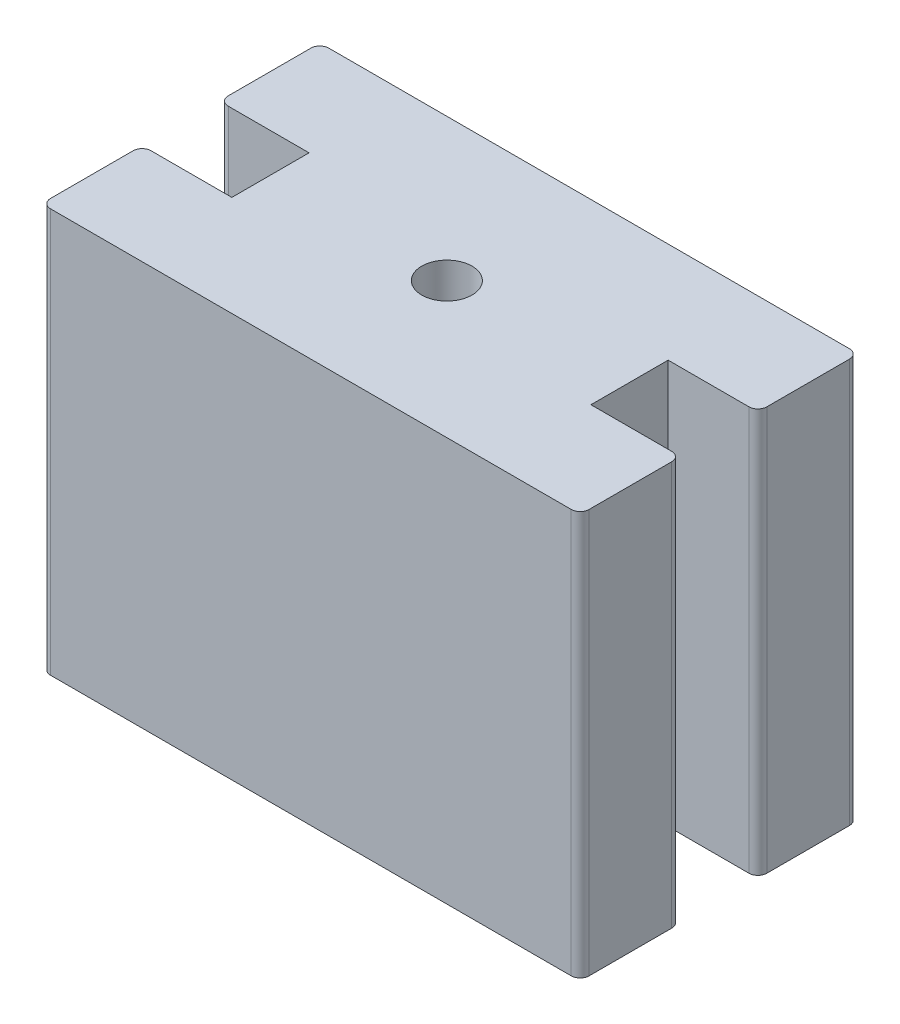
ISO-10303-21;
HEADER;
FILE_DESCRIPTION(('STEP AP214'),'2;1');
FILE_NAME('part.step','',(''),(''),'','','');
FILE_SCHEMA(('AUTOMOTIVE_DESIGN { 1 0 10303 214 1 1 1 1 }'));
ENDSEC;
DATA;
#1=APPLICATION_CONTEXT('core data for automotive mechanical design processes');
#2=APPLICATION_PROTOCOL_DEFINITION('international standard','automotive_design',2000,#1);
#3=PRODUCT_CONTEXT('',#1,'mechanical');
#4=PRODUCT('Part','Part','',(#3));
#5=PRODUCT_RELATED_PRODUCT_CATEGORY('part','',(#4));
#6=PRODUCT_DEFINITION_FORMATION('','',#4);
#7=PRODUCT_DEFINITION_CONTEXT('part definition',#1,'design');
#8=PRODUCT_DEFINITION('design','',#6,#7);
#9=PRODUCT_DEFINITION_SHAPE('','',#8);
#10=(LENGTH_UNIT() NAMED_UNIT(*) SI_UNIT(.MILLI.,.METRE.));
#11=(NAMED_UNIT(*) PLANE_ANGLE_UNIT() SI_UNIT($,.RADIAN.));
#12=(NAMED_UNIT(*) SI_UNIT($,.STERADIAN.) SOLID_ANGLE_UNIT());
#13=UNCERTAINTY_MEASURE_WITH_UNIT(LENGTH_MEASURE(1.E-05),#10,'distance_accuracy_value','');
#14=(GEOMETRIC_REPRESENTATION_CONTEXT(3) GLOBAL_UNCERTAINTY_ASSIGNED_CONTEXT((#13)) GLOBAL_UNIT_ASSIGNED_CONTEXT((#10,
#11,#12)) REPRESENTATION_CONTEXT('',''));
#15=CARTESIAN_POINT('',(0.,0.,0.));
#16=DIRECTION('',(0.,0.,1.));
#17=DIRECTION('',(1.,0.,0.));
#18=AXIS2_PLACEMENT_3D('',#15,#16,#17);
#19=CARTESIAN_POINT('',(29.,45.,-14.85));
#20=DIRECTION('',(0.,-1.,0.));
#21=DIRECTION('',(0.,0.,-1.));
#22=AXIS2_PLACEMENT_3D('',#19,#20,#21);
#23=CYLINDRICAL_SURFACE('',#22,0.999999999999999);
#24=CARTESIAN_POINT('',(29.,0.,-14.85));
#25=DIRECTION('',(0.,1.,0.));
#26=DIRECTION('',(0.,0.,1.));
#27=AXIS2_PLACEMENT_3D('',#24,#25,#26);
#28=CIRCLE('',#27,0.999999999999999);
#29=CARTESIAN_POINT('',(29.,0.,-15.85));
#30=VERTEX_POINT('',#29);
#31=CARTESIAN_POINT('',(30.,0.,-14.85));
#32=VERTEX_POINT('',#31);
#33=EDGE_CURVE('E292',#30,#32,#28,.F.);
#34=ORIENTED_EDGE('',*,*,#33,.F.);
#35=DIRECTION('',(0.,-1.,0.));
#36=VECTOR('',#35,1.);
#37=CARTESIAN_POINT('',(29.,45.,-15.85));
#38=LINE('',#37,#36);
#39=CARTESIAN_POINT('',(29.,45.,-15.85));
#40=VERTEX_POINT('',#39);
#41=EDGE_CURVE('E11',#40,#30,#38,.T.);
#42=ORIENTED_EDGE('',*,*,#41,.F.);
#43=CARTESIAN_POINT('',(29.,45.,-14.85));
#44=DIRECTION('',(0.,1.,0.));
#45=DIRECTION('',(0.,0.,1.));
#46=AXIS2_PLACEMENT_3D('',#43,#44,#45);
#47=CIRCLE('',#46,0.999999999999999);
#48=CARTESIAN_POINT('',(30.,45.,-14.85));
#49=VERTEX_POINT('',#48);
#50=EDGE_CURVE('E452',#40,#49,#47,.F.);
#51=ORIENTED_EDGE('',*,*,#50,.T.);
#52=DIRECTION('',(0.,-1.,0.));
#53=VECTOR('',#52,1.);
#54=CARTESIAN_POINT('',(30.,45.,-14.85));
#55=LINE('',#54,#53);
#56=EDGE_CURVE('E64',#49,#32,#55,.T.);
#57=ORIENTED_EDGE('',*,*,#56,.T.);
#58=EDGE_LOOP('',(#34,#42,#51,#57));
#59=FACE_BOUND('',#58,.T.);
#60=ADVANCED_FACE('F50',(#59),#23,.T.);
#61=CARTESIAN_POINT('',(0.,45.,-15.85));
#62=DIRECTION('',(0.,0.,-1.));
#63=DIRECTION('',(-1.,0.,0.));
#64=AXIS2_PLACEMENT_3D('',#61,#62,#63);
#65=PLANE('',#64);
#66=DIRECTION('',(1.,0.,0.));
#67=VECTOR('',#66,1.);
#68=CARTESIAN_POINT('',(0.,0.,-15.85));
#69=LINE('',#68,#67);
#70=CARTESIAN_POINT('',(-29.,0.,-15.85));
#71=VERTEX_POINT('',#70);
#72=EDGE_CURVE('E283',#71,#30,#69,.T.);
#73=ORIENTED_EDGE('',*,*,#72,.F.);
#74=DIRECTION('',(0.,-1.,0.));
#75=VECTOR('',#74,1.);
#76=CARTESIAN_POINT('',(-29.,45.,-15.85));
#77=LINE('',#76,#75);
#78=CARTESIAN_POINT('',(-29.,45.,-15.85));
#79=VERTEX_POINT('',#78);
#80=EDGE_CURVE('E60',#79,#71,#77,.T.);
#81=ORIENTED_EDGE('',*,*,#80,.F.);
#82=DIRECTION('',(1.,0.,0.));
#83=VECTOR('',#82,1.);
#84=CARTESIAN_POINT('',(0.,45.,-15.85));
#85=LINE('',#84,#83);
#86=EDGE_CURVE('E457',#79,#40,#85,.T.);
#87=ORIENTED_EDGE('',*,*,#86,.T.);
#88=ORIENTED_EDGE('',*,*,#41,.T.);
#89=EDGE_LOOP('',(#73,#81,#87,#88));
#90=FACE_BOUND('',#89,.T.);
#91=ADVANCED_FACE('F288',(#90),#65,.T.);
#92=CARTESIAN_POINT('',(-29.,45.,-14.85));
#93=DIRECTION('',(0.,-1.,0.));
#94=DIRECTION('',(0.,0.,-1.));
#95=AXIS2_PLACEMENT_3D('',#92,#93,#94);
#96=CYLINDRICAL_SURFACE('',#95,1.);
#97=CARTESIAN_POINT('',(-29.,0.,-14.85));
#98=DIRECTION('',(0.,1.,0.));
#99=DIRECTION('',(0.,0.,1.));
#100=AXIS2_PLACEMENT_3D('',#97,#98,#99);
#101=CIRCLE('',#100,1.);
#102=CARTESIAN_POINT('',(-30.,0.,-14.85));
#103=VERTEX_POINT('',#102);
#104=EDGE_CURVE('E273',#71,#103,#101,.T.);
#105=ORIENTED_EDGE('',*,*,#104,.T.);
#106=DIRECTION('',(0.,-1.,0.));
#107=VECTOR('',#106,1.);
#108=CARTESIAN_POINT('',(-30.,45.,-14.85));
#109=LINE('',#108,#107);
#110=CARTESIAN_POINT('',(-30.,45.,-14.85));
#111=VERTEX_POINT('',#110);
#112=EDGE_CURVE('E262',#111,#103,#109,.T.);
#113=ORIENTED_EDGE('',*,*,#112,.F.);
#114=CARTESIAN_POINT('',(-29.,45.,-14.85));
#115=DIRECTION('',(0.,1.,0.));
#116=DIRECTION('',(0.,0.,1.));
#117=AXIS2_PLACEMENT_3D('',#114,#115,#116);
#118=CIRCLE('',#117,1.);
#119=EDGE_CURVE('E277',#79,#111,#118,.T.);
#120=ORIENTED_EDGE('',*,*,#119,.F.);
#121=ORIENTED_EDGE('',*,*,#80,.T.);
#122=EDGE_LOOP('',(#105,#113,#120,#121));
#123=FACE_BOUND('',#122,.T.);
#124=ADVANCED_FACE('F275',(#123),#96,.T.);
#125=CARTESIAN_POINT('',(-30.,45.,0.));
#126=DIRECTION('',(1.,0.,0.));
#127=DIRECTION('',(0.,0.,-1.));
#128=AXIS2_PLACEMENT_3D('',#125,#126,#127);
#129=PLANE('',#128);
#130=DIRECTION('',(0.,0.,1.));
#131=VECTOR('',#130,1.);
#132=CARTESIAN_POINT('',(-30.,0.,0.));
#133=LINE('',#132,#131);
#134=CARTESIAN_POINT('',(-30.,0.,-5.65000000000001));
#135=VERTEX_POINT('',#134);
#136=EDGE_CURVE('E286',#103,#135,#133,.T.);
#137=ORIENTED_EDGE('',*,*,#136,.T.);
#138=DIRECTION('',(0.,-1.,0.));
#139=VECTOR('',#138,1.);
#140=CARTESIAN_POINT('',(-30.,45.,-5.65000000000001));
#141=LINE('',#140,#139);
#142=CARTESIAN_POINT('',(-30.,45.,-5.65000000000001));
#143=VERTEX_POINT('',#142);
#144=EDGE_CURVE('E257',#143,#135,#141,.T.);
#145=ORIENTED_EDGE('',*,*,#144,.F.);
#146=DIRECTION('',(0.,0.,1.));
#147=VECTOR('',#146,1.);
#148=CARTESIAN_POINT('',(-30.,45.,0.));
#149=LINE('',#148,#147);
#150=EDGE_CURVE('E462',#111,#143,#149,.T.);
#151=ORIENTED_EDGE('',*,*,#150,.F.);
#152=ORIENTED_EDGE('',*,*,#112,.T.);
#153=EDGE_LOOP('',(#137,#145,#151,#152));
#154=FACE_BOUND('',#153,.T.);
#155=ADVANCED_FACE('F390',(#154),#129,.F.);
#156=CARTESIAN_POINT('',(-29.,45.,-5.65));
#157=DIRECTION('',(0.,-1.,0.));
#158=DIRECTION('',(0.,0.,-1.));
#159=AXIS2_PLACEMENT_3D('',#156,#157,#158);
#160=CYLINDRICAL_SURFACE('',#159,1.);
#161=CARTESIAN_POINT('',(-29.,0.,-5.65));
#162=DIRECTION('',(0.,1.,0.));
#163=DIRECTION('',(0.,0.,1.));
#164=AXIS2_PLACEMENT_3D('',#161,#162,#163);
#165=CIRCLE('',#164,1.);
#166=CARTESIAN_POINT('',(-29.,0.,-4.65));
#167=VERTEX_POINT('',#166);
#168=EDGE_CURVE('E299',#135,#167,#165,.T.);
#169=ORIENTED_EDGE('',*,*,#168,.T.);
#170=DIRECTION('',(0.,-1.,0.));
#171=VECTOR('',#170,1.);
#172=CARTESIAN_POINT('',(-29.,45.,-4.65));
#173=LINE('',#172,#171);
#174=CARTESIAN_POINT('',(-29.,45.,-4.65));
#175=VERTEX_POINT('',#174);
#176=EDGE_CURVE('E258',#175,#167,#173,.T.);
#177=ORIENTED_EDGE('',*,*,#176,.F.);
#178=CARTESIAN_POINT('',(-29.,45.,-5.65));
#179=DIRECTION('',(0.,1.,0.));
#180=DIRECTION('',(0.,0.,1.));
#181=AXIS2_PLACEMENT_3D('',#178,#179,#180);
#182=CIRCLE('',#181,1.);
#183=EDGE_CURVE('E470',#143,#175,#182,.T.);
#184=ORIENTED_EDGE('',*,*,#183,.F.);
#185=ORIENTED_EDGE('',*,*,#144,.T.);
#186=EDGE_LOOP('',(#169,#177,#184,#185));
#187=FACE_BOUND('',#186,.T.);
#188=ADVANCED_FACE('F388',(#187),#160,.T.);
#189=CARTESIAN_POINT('',(0.,45.,-4.65));
#190=DIRECTION('',(0.,0.,-1.));
#191=DIRECTION('',(-1.,0.,0.));
#192=AXIS2_PLACEMENT_3D('',#189,#190,#191);
#193=PLANE('',#192);
#194=DIRECTION('',(1.,0.,0.));
#195=VECTOR('',#194,1.);
#196=CARTESIAN_POINT('',(0.,0.,-4.65));
#197=LINE('',#196,#195);
#198=CARTESIAN_POINT('',(-20.,0.,-4.65));
#199=VERTEX_POINT('',#198);
#200=EDGE_CURVE('E303',#167,#199,#197,.T.);
#201=ORIENTED_EDGE('',*,*,#200,.T.);
#202=DIRECTION('',(0.,-1.,0.));
#203=VECTOR('',#202,1.);
#204=CARTESIAN_POINT('',(-20.,45.,-4.65));
#205=LINE('',#204,#203);
#206=CARTESIAN_POINT('',(-20.,45.,-4.65));
#207=VERTEX_POINT('',#206);
#208=EDGE_CURVE('E252',#207,#199,#205,.T.);
#209=ORIENTED_EDGE('',*,*,#208,.F.);
#210=DIRECTION('',(1.,0.,0.));
#211=VECTOR('',#210,1.);
#212=CARTESIAN_POINT('',(0.,45.,-4.65));
#213=LINE('',#212,#211);
#214=EDGE_CURVE('E473',#175,#207,#213,.T.);
#215=ORIENTED_EDGE('',*,*,#214,.F.);
#216=ORIENTED_EDGE('',*,*,#176,.T.);
#217=EDGE_LOOP('',(#201,#209,#215,#216));
#218=FACE_BOUND('',#217,.T.);
#219=ADVANCED_FACE('F393',(#218),#193,.F.);
#220=CARTESIAN_POINT('',(-20.,45.,0.));
#221=DIRECTION('',(1.,0.,0.));
#222=DIRECTION('',(0.,0.,-1.));
#223=AXIS2_PLACEMENT_3D('',#220,#221,#222);
#224=PLANE('',#223);
#225=DIRECTION('',(0.,0.,1.));
#226=VECTOR('',#225,1.);
#227=CARTESIAN_POINT('',(-20.,0.,0.));
#228=LINE('',#227,#226);
#229=CARTESIAN_POINT('',(-20.,0.,3.95));
#230=VERTEX_POINT('',#229);
#231=EDGE_CURVE('E306',#199,#230,#228,.T.);
#232=ORIENTED_EDGE('',*,*,#231,.T.);
#233=DIRECTION('',(0.,-1.,0.));
#234=VECTOR('',#233,1.);
#235=CARTESIAN_POINT('',(-20.,45.,3.95));
#236=LINE('',#235,#234);
#237=CARTESIAN_POINT('',(-20.,45.,3.95));
#238=VERTEX_POINT('',#237);
#239=EDGE_CURVE('E248',#238,#230,#236,.T.);
#240=ORIENTED_EDGE('',*,*,#239,.F.);
#241=DIRECTION('',(0.,0.,1.));
#242=VECTOR('',#241,1.);
#243=CARTESIAN_POINT('',(-20.,45.,0.));
#244=LINE('',#243,#242);
#245=EDGE_CURVE('E474',#207,#238,#244,.T.);
#246=ORIENTED_EDGE('',*,*,#245,.F.);
#247=ORIENTED_EDGE('',*,*,#208,.T.);
#248=EDGE_LOOP('',(#232,#240,#246,#247));
#249=FACE_BOUND('',#248,.T.);
#250=ADVANCED_FACE('F397',(#249),#224,.F.);
#251=CARTESIAN_POINT('',(0.,45.,3.95));
#252=DIRECTION('',(0.,0.,-1.));
#253=DIRECTION('',(-1.,0.,0.));
#254=AXIS2_PLACEMENT_3D('',#251,#252,#253);
#255=PLANE('',#254);
#256=DIRECTION('',(1.,0.,0.));
#257=VECTOR('',#256,1.);
#258=CARTESIAN_POINT('',(0.,0.,3.95));
#259=LINE('',#258,#257);
#260=CARTESIAN_POINT('',(-29.,0.,3.95));
#261=VERTEX_POINT('',#260);
#262=EDGE_CURVE('E315',#261,#230,#259,.T.);
#263=ORIENTED_EDGE('',*,*,#262,.F.);
#264=DIRECTION('',(0.,-1.,0.));
#265=VECTOR('',#264,1.);
#266=CARTESIAN_POINT('',(-29.,45.,3.95));
#267=LINE('',#266,#265);
#268=CARTESIAN_POINT('',(-29.,45.,3.95));
#269=VERTEX_POINT('',#268);
#270=EDGE_CURVE('E246',#269,#261,#267,.T.);
#271=ORIENTED_EDGE('',*,*,#270,.F.);
#272=DIRECTION('',(1.,0.,0.));
#273=VECTOR('',#272,1.);
#274=CARTESIAN_POINT('',(0.,45.,3.95));
#275=LINE('',#274,#273);
#276=EDGE_CURVE('E476',#269,#238,#275,.T.);
#277=ORIENTED_EDGE('',*,*,#276,.T.);
#278=ORIENTED_EDGE('',*,*,#239,.T.);
#279=EDGE_LOOP('',(#263,#271,#277,#278));
#280=FACE_BOUND('',#279,.T.);
#281=ADVANCED_FACE('F405',(#280),#255,.T.);
#282=CARTESIAN_POINT('',(-29.,45.,4.95));
#283=DIRECTION('',(0.,-1.,0.));
#284=DIRECTION('',(0.,0.,-1.));
#285=AXIS2_PLACEMENT_3D('',#282,#283,#284);
#286=CYLINDRICAL_SURFACE('',#285,1.);
#287=CARTESIAN_POINT('',(-29.,0.,4.95));
#288=DIRECTION('',(0.,1.,0.));
#289=DIRECTION('',(0.,0.,1.));
#290=AXIS2_PLACEMENT_3D('',#287,#288,#289);
#291=CIRCLE('',#290,1.);
#292=CARTESIAN_POINT('',(-30.,0.,4.95));
#293=VERTEX_POINT('',#292);
#294=EDGE_CURVE('E316',#293,#261,#291,.F.);
#295=ORIENTED_EDGE('',*,*,#294,.F.);
#296=DIRECTION('',(0.,-1.,0.));
#297=VECTOR('',#296,1.);
#298=CARTESIAN_POINT('',(-30.,45.,4.95));
#299=LINE('',#298,#297);
#300=CARTESIAN_POINT('',(-30.,45.,4.95));
#301=VERTEX_POINT('',#300);
#302=EDGE_CURVE('E242',#301,#293,#299,.T.);
#303=ORIENTED_EDGE('',*,*,#302,.F.);
#304=CARTESIAN_POINT('',(-29.,45.,4.95));
#305=DIRECTION('',(0.,1.,0.));
#306=DIRECTION('',(0.,0.,1.));
#307=AXIS2_PLACEMENT_3D('',#304,#305,#306);
#308=CIRCLE('',#307,1.);
#309=EDGE_CURVE('E485',#301,#269,#308,.F.);
#310=ORIENTED_EDGE('',*,*,#309,.T.);
#311=ORIENTED_EDGE('',*,*,#270,.T.);
#312=EDGE_LOOP('',(#295,#303,#310,#311));
#313=FACE_BOUND('',#312,.T.);
#314=ADVANCED_FACE('F406',(#313),#286,.T.);
#315=CARTESIAN_POINT('',(-30.,45.,0.));
#316=DIRECTION('',(-1.,0.,0.));
#317=DIRECTION('',(0.,0.,1.));
#318=AXIS2_PLACEMENT_3D('',#315,#316,#317);
#319=PLANE('',#318);
#320=DIRECTION('',(0.,0.,-1.));
#321=VECTOR('',#320,1.);
#322=CARTESIAN_POINT('',(-30.,0.,0.));
#323=LINE('',#322,#321);
#324=CARTESIAN_POINT('',(-30.,0.,14.15));
#325=VERTEX_POINT('',#324);
#326=EDGE_CURVE('E319',#325,#293,#323,.T.);
#327=ORIENTED_EDGE('',*,*,#326,.F.);
#328=DIRECTION('',(0.,-1.,0.));
#329=VECTOR('',#328,1.);
#330=CARTESIAN_POINT('',(-30.,45.,14.15));
#331=LINE('',#330,#329);
#332=CARTESIAN_POINT('',(-30.,45.,14.15));
#333=VERTEX_POINT('',#332);
#334=EDGE_CURVE('E238',#333,#325,#331,.T.);
#335=ORIENTED_EDGE('',*,*,#334,.F.);
#336=DIRECTION('',(0.,0.,-1.));
#337=VECTOR('',#336,1.);
#338=CARTESIAN_POINT('',(-30.,45.,0.));
#339=LINE('',#338,#337);
#340=EDGE_CURVE('E486',#333,#301,#339,.T.);
#341=ORIENTED_EDGE('',*,*,#340,.T.);
#342=ORIENTED_EDGE('',*,*,#302,.T.);
#343=EDGE_LOOP('',(#327,#335,#341,#342));
#344=FACE_BOUND('',#343,.T.);
#345=ADVANCED_FACE('F409',(#344),#319,.T.);
#346=CARTESIAN_POINT('',(-29.,45.,14.15));
#347=DIRECTION('',(0.,-1.,0.));
#348=DIRECTION('',(0.,0.,-1.));
#349=AXIS2_PLACEMENT_3D('',#346,#347,#348);
#350=CYLINDRICAL_SURFACE('',#349,1.);
#351=CARTESIAN_POINT('',(-29.,0.,14.15));
#352=DIRECTION('',(0.,1.,0.));
#353=DIRECTION('',(0.,0.,1.));
#354=AXIS2_PLACEMENT_3D('',#351,#352,#353);
#355=CIRCLE('',#354,1.);
#356=CARTESIAN_POINT('',(-29.,0.,15.15));
#357=VERTEX_POINT('',#356);
#358=EDGE_CURVE('E322',#357,#325,#355,.F.);
#359=ORIENTED_EDGE('',*,*,#358,.F.);
#360=DIRECTION('',(0.,-1.,0.));
#361=VECTOR('',#360,1.);
#362=CARTESIAN_POINT('',(-29.,45.,15.15));
#363=LINE('',#362,#361);
#364=CARTESIAN_POINT('',(-29.,45.,15.15));
#365=VERTEX_POINT('',#364);
#366=EDGE_CURVE('E240',#365,#357,#363,.T.);
#367=ORIENTED_EDGE('',*,*,#366,.F.);
#368=CARTESIAN_POINT('',(-29.,45.,14.15));
#369=DIRECTION('',(0.,1.,0.));
#370=DIRECTION('',(0.,0.,1.));
#371=AXIS2_PLACEMENT_3D('',#368,#369,#370);
#372=CIRCLE('',#371,1.);
#373=EDGE_CURVE('E489',#365,#333,#372,.F.);
#374=ORIENTED_EDGE('',*,*,#373,.T.);
#375=ORIENTED_EDGE('',*,*,#334,.T.);
#376=EDGE_LOOP('',(#359,#367,#374,#375));
#377=FACE_BOUND('',#376,.T.);
#378=ADVANCED_FACE('F413',(#377),#350,.T.);
#379=CARTESIAN_POINT('',(0.,45.,15.15));
#380=DIRECTION('',(0.,0.,-1.));
#381=DIRECTION('',(-1.,0.,0.));
#382=AXIS2_PLACEMENT_3D('',#379,#380,#381);
#383=PLANE('',#382);
#384=DIRECTION('',(1.,0.,0.));
#385=VECTOR('',#384,1.);
#386=CARTESIAN_POINT('',(0.,0.,15.15));
#387=LINE('',#386,#385);
#388=CARTESIAN_POINT('',(29.,0.,15.15));
#389=VERTEX_POINT('',#388);
#390=EDGE_CURVE('E327',#357,#389,#387,.T.);
#391=ORIENTED_EDGE('',*,*,#390,.T.);
#392=DIRECTION('',(0.,-1.,0.));
#393=VECTOR('',#392,1.);
#394=CARTESIAN_POINT('',(29.,45.,15.15));
#395=LINE('',#394,#393);
#396=CARTESIAN_POINT('',(29.,45.,15.15));
#397=VERTEX_POINT('',#396);
#398=EDGE_CURVE('E232',#397,#389,#395,.T.);
#399=ORIENTED_EDGE('',*,*,#398,.F.);
#400=DIRECTION('',(1.,0.,0.));
#401=VECTOR('',#400,1.);
#402=CARTESIAN_POINT('',(0.,45.,15.15));
#403=LINE('',#402,#401);
#404=EDGE_CURVE('E493',#365,#397,#403,.T.);
#405=ORIENTED_EDGE('',*,*,#404,.F.);
#406=ORIENTED_EDGE('',*,*,#366,.T.);
#407=EDGE_LOOP('',(#391,#399,#405,#406));
#408=FACE_BOUND('',#407,.T.);
#409=ADVANCED_FACE('F416',(#408),#383,.F.);
#410=CARTESIAN_POINT('',(29.,45.,14.15));
#411=DIRECTION('',(0.,-1.,0.));
#412=DIRECTION('',(0.,0.,-1.));
#413=AXIS2_PLACEMENT_3D('',#410,#411,#412);
#414=CYLINDRICAL_SURFACE('',#413,1.);
#415=CARTESIAN_POINT('',(29.,0.,14.15));
#416=DIRECTION('',(0.,1.,0.));
#417=DIRECTION('',(0.,0.,1.));
#418=AXIS2_PLACEMENT_3D('',#415,#416,#417);
#419=CIRCLE('',#418,1.);
#420=CARTESIAN_POINT('',(30.,0.,14.15));
#421=VERTEX_POINT('',#420);
#422=EDGE_CURVE('E335',#389,#421,#419,.T.);
#423=ORIENTED_EDGE('',*,*,#422,.T.);
#424=DIRECTION('',(0.,-1.,0.));
#425=VECTOR('',#424,1.);
#426=CARTESIAN_POINT('',(30.,45.,14.15));
#427=LINE('',#426,#425);
#428=CARTESIAN_POINT('',(30.,45.,14.15));
#429=VERTEX_POINT('',#428);
#430=EDGE_CURVE('E228',#429,#421,#427,.T.);
#431=ORIENTED_EDGE('',*,*,#430,.F.);
#432=CARTESIAN_POINT('',(29.,45.,14.15));
#433=DIRECTION('',(0.,1.,0.));
#434=DIRECTION('',(0.,0.,1.));
#435=AXIS2_PLACEMENT_3D('',#432,#433,#434);
#436=CIRCLE('',#435,1.);
#437=EDGE_CURVE('E499',#397,#429,#436,.T.);
#438=ORIENTED_EDGE('',*,*,#437,.F.);
#439=ORIENTED_EDGE('',*,*,#398,.T.);
#440=EDGE_LOOP('',(#423,#431,#438,#439));
#441=FACE_BOUND('',#440,.T.);
#442=ADVANCED_FACE('F425',(#441),#414,.T.);
#443=CARTESIAN_POINT('',(30.,45.,0.));
#444=DIRECTION('',(-1.,0.,0.));
#445=DIRECTION('',(0.,0.,1.));
#446=AXIS2_PLACEMENT_3D('',#443,#444,#445);
#447=PLANE('',#446);
#448=DIRECTION('',(0.,0.,-1.));
#449=VECTOR('',#448,1.);
#450=CARTESIAN_POINT('',(30.,0.,0.));
#451=LINE('',#450,#449);
#452=CARTESIAN_POINT('',(30.,0.,4.95));
#453=VERTEX_POINT('',#452);
#454=EDGE_CURVE('E336',#421,#453,#451,.T.);
#455=ORIENTED_EDGE('',*,*,#454,.T.);
#456=DIRECTION('',(0.,-1.,0.));
#457=VECTOR('',#456,1.);
#458=CARTESIAN_POINT('',(30.,45.,4.95));
#459=LINE('',#458,#457);
#460=CARTESIAN_POINT('',(30.,45.,4.95));
#461=VERTEX_POINT('',#460);
#462=EDGE_CURVE('E226',#461,#453,#459,.T.);
#463=ORIENTED_EDGE('',*,*,#462,.F.);
#464=DIRECTION('',(0.,0.,-1.));
#465=VECTOR('',#464,1.);
#466=CARTESIAN_POINT('',(30.,45.,0.));
#467=LINE('',#466,#465);
#468=EDGE_CURVE('E505',#429,#461,#467,.T.);
#469=ORIENTED_EDGE('',*,*,#468,.F.);
#470=ORIENTED_EDGE('',*,*,#430,.T.);
#471=EDGE_LOOP('',(#455,#463,#469,#470));
#472=FACE_BOUND('',#471,.T.);
#473=ADVANCED_FACE('F426',(#472),#447,.F.);
#474=CARTESIAN_POINT('',(29.,45.,4.95));
#475=DIRECTION('',(0.,-1.,0.));
#476=DIRECTION('',(0.,0.,-1.));
#477=AXIS2_PLACEMENT_3D('',#474,#475,#476);
#478=CYLINDRICAL_SURFACE('',#477,1.);
#479=CARTESIAN_POINT('',(29.,0.,4.95));
#480=DIRECTION('',(0.,1.,0.));
#481=DIRECTION('',(0.,0.,1.));
#482=AXIS2_PLACEMENT_3D('',#479,#480,#481);
#483=CIRCLE('',#482,1.);
#484=CARTESIAN_POINT('',(29.,0.,3.95));
#485=VERTEX_POINT('',#484);
#486=EDGE_CURVE('E339',#485,#453,#483,.F.);
#487=ORIENTED_EDGE('',*,*,#486,.F.);
#488=DIRECTION('',(0.,-1.,0.));
#489=VECTOR('',#488,1.);
#490=CARTESIAN_POINT('',(29.,45.,3.95));
#491=LINE('',#490,#489);
#492=CARTESIAN_POINT('',(29.,45.,3.95));
#493=VERTEX_POINT('',#492);
#494=EDGE_CURVE('E224',#493,#485,#491,.T.);
#495=ORIENTED_EDGE('',*,*,#494,.F.);
#496=CARTESIAN_POINT('',(29.,45.,4.95));
#497=DIRECTION('',(0.,1.,0.));
#498=DIRECTION('',(0.,0.,1.));
#499=AXIS2_PLACEMENT_3D('',#496,#497,#498);
#500=CIRCLE('',#499,1.);
#501=EDGE_CURVE('E504',#493,#461,#500,.F.);
#502=ORIENTED_EDGE('',*,*,#501,.T.);
#503=ORIENTED_EDGE('',*,*,#462,.T.);
#504=EDGE_LOOP('',(#487,#495,#502,#503));
#505=FACE_BOUND('',#504,.T.);
#506=ADVANCED_FACE('F429',(#505),#478,.T.);
#507=CARTESIAN_POINT('',(0.,45.,3.95));
#508=DIRECTION('',(0.,0.,-1.));
#509=DIRECTION('',(-1.,0.,0.));
#510=AXIS2_PLACEMENT_3D('',#507,#508,#509);
#511=PLANE('',#510);
#512=DIRECTION('',(1.,0.,0.));
#513=VECTOR('',#512,1.);
#514=CARTESIAN_POINT('',(0.,0.,3.95));
#515=LINE('',#514,#513);
#516=CARTESIAN_POINT('',(20.,0.,3.95));
#517=VERTEX_POINT('',#516);
#518=EDGE_CURVE('E343',#517,#485,#515,.T.);
#519=ORIENTED_EDGE('',*,*,#518,.F.);
#520=DIRECTION('',(0.,-1.,0.));
#521=VECTOR('',#520,1.);
#522=CARTESIAN_POINT('',(20.,45.,3.95));
#523=LINE('',#522,#521);
#524=CARTESIAN_POINT('',(20.,45.,3.95));
#525=VERTEX_POINT('',#524);
#526=EDGE_CURVE('E216',#525,#517,#523,.T.);
#527=ORIENTED_EDGE('',*,*,#526,.F.);
#528=DIRECTION('',(1.,0.,0.));
#529=VECTOR('',#528,1.);
#530=CARTESIAN_POINT('',(0.,45.,3.95));
#531=LINE('',#530,#529);
#532=EDGE_CURVE('E508',#525,#493,#531,.T.);
#533=ORIENTED_EDGE('',*,*,#532,.T.);
#534=ORIENTED_EDGE('',*,*,#494,.T.);
#535=EDGE_LOOP('',(#519,#527,#533,#534));
#536=FACE_BOUND('',#535,.T.);
#537=ADVANCED_FACE('F432',(#536),#511,.T.);
#538=CARTESIAN_POINT('',(20.,45.,0.));
#539=DIRECTION('',(1.,0.,0.));
#540=DIRECTION('',(0.,0.,-1.));
#541=AXIS2_PLACEMENT_3D('',#538,#539,#540);
#542=PLANE('',#541);
#543=DIRECTION('',(0.,0.,1.));
#544=VECTOR('',#543,1.);
#545=CARTESIAN_POINT('',(20.,0.,0.));
#546=LINE('',#545,#544);
#547=CARTESIAN_POINT('',(20.,0.,-4.65));
#548=VERTEX_POINT('',#547);
#549=EDGE_CURVE('E346',#548,#517,#546,.T.);
#550=ORIENTED_EDGE('',*,*,#549,.F.);
#551=DIRECTION('',(0.,-1.,0.));
#552=VECTOR('',#551,1.);
#553=CARTESIAN_POINT('',(20.,45.,-4.65));
#554=LINE('',#553,#552);
#555=CARTESIAN_POINT('',(20.,45.,-4.65));
#556=VERTEX_POINT('',#555);
#557=EDGE_CURVE('E215',#556,#548,#554,.T.);
#558=ORIENTED_EDGE('',*,*,#557,.F.);
#559=DIRECTION('',(0.,0.,1.));
#560=VECTOR('',#559,1.);
#561=CARTESIAN_POINT('',(20.,45.,0.));
#562=LINE('',#561,#560);
#563=EDGE_CURVE('E204',#556,#525,#562,.T.);
#564=ORIENTED_EDGE('',*,*,#563,.T.);
#565=ORIENTED_EDGE('',*,*,#526,.T.);
#566=EDGE_LOOP('',(#550,#558,#564,#565));
#567=FACE_BOUND('',#566,.T.);
#568=ADVANCED_FACE('F437',(#567),#542,.T.);
#569=CARTESIAN_POINT('',(0.,45.,-4.65));
#570=DIRECTION('',(0.,0.,-1.));
#571=DIRECTION('',(-1.,0.,0.));
#572=AXIS2_PLACEMENT_3D('',#569,#570,#571);
#573=PLANE('',#572);
#574=DIRECTION('',(1.,0.,0.));
#575=VECTOR('',#574,1.);
#576=CARTESIAN_POINT('',(0.,0.,-4.65));
#577=LINE('',#576,#575);
#578=CARTESIAN_POINT('',(29.,0.,-4.65));
#579=VERTEX_POINT('',#578);
#580=EDGE_CURVE('E209',#548,#579,#577,.T.);
#581=ORIENTED_EDGE('',*,*,#580,.T.);
#582=DIRECTION('',(0.,-1.,0.));
#583=VECTOR('',#582,1.);
#584=CARTESIAN_POINT('',(29.,45.,-4.65));
#585=LINE('',#584,#583);
#586=CARTESIAN_POINT('',(29.,45.,-4.65));
#587=VERTEX_POINT('',#586);
#588=EDGE_CURVE('E191',#587,#579,#585,.T.);
#589=ORIENTED_EDGE('',*,*,#588,.F.);
#590=DIRECTION('',(1.,0.,0.));
#591=VECTOR('',#590,1.);
#592=CARTESIAN_POINT('',(0.,45.,-4.65));
#593=LINE('',#592,#591);
#594=EDGE_CURVE('E197',#556,#587,#593,.T.);
#595=ORIENTED_EDGE('',*,*,#594,.F.);
#596=ORIENTED_EDGE('',*,*,#557,.T.);
#597=EDGE_LOOP('',(#581,#589,#595,#596));
#598=FACE_BOUND('',#597,.T.);
#599=ADVANCED_FACE('F208',(#598),#573,.F.);
#600=CARTESIAN_POINT('',(29.,45.,-5.65));
#601=DIRECTION('',(0.,-1.,0.));
#602=DIRECTION('',(0.,0.,-1.));
#603=AXIS2_PLACEMENT_3D('',#600,#601,#602);
#604=CYLINDRICAL_SURFACE('',#603,1.);
#605=CARTESIAN_POINT('',(29.,0.,-5.65));
#606=DIRECTION('',(0.,1.,0.));
#607=DIRECTION('',(0.,0.,1.));
#608=AXIS2_PLACEMENT_3D('',#605,#606,#607);
#609=CIRCLE('',#608,1.);
#610=CARTESIAN_POINT('',(30.,0.,-5.65000000000001));
#611=VERTEX_POINT('',#610);
#612=EDGE_CURVE('E353',#579,#611,#609,.T.);
#613=ORIENTED_EDGE('',*,*,#612,.T.);
#614=DIRECTION('',(0.,-1.,0.));
#615=VECTOR('',#614,1.);
#616=CARTESIAN_POINT('',(30.,45.,-5.65000000000001));
#617=LINE('',#616,#615);
#618=CARTESIAN_POINT('',(30.,45.,-5.65000000000001));
#619=VERTEX_POINT('',#618);
#620=EDGE_CURVE('E130',#619,#611,#617,.T.);
#621=ORIENTED_EDGE('',*,*,#620,.F.);
#622=CARTESIAN_POINT('',(29.,45.,-5.65));
#623=DIRECTION('',(0.,1.,0.));
#624=DIRECTION('',(0.,0.,1.));
#625=AXIS2_PLACEMENT_3D('',#622,#623,#624);
#626=CIRCLE('',#625,1.);
#627=EDGE_CURVE('E190',#587,#619,#626,.T.);
#628=ORIENTED_EDGE('',*,*,#627,.F.);
#629=ORIENTED_EDGE('',*,*,#588,.T.);
#630=EDGE_LOOP('',(#613,#621,#628,#629));
#631=FACE_BOUND('',#630,.T.);
#632=ADVANCED_FACE('F188',(#631),#604,.T.);
#633=CARTESIAN_POINT('',(0.,45.,0.));
#634=DIRECTION('',(0.,-1.,0.));
#635=DIRECTION('',(0.,0.,-1.));
#636=AXIS2_PLACEMENT_3D('',#633,#634,#635);
#637=CYLINDRICAL_SURFACE('',#636,2.8);
#638=CARTESIAN_POINT('',(0.,45.,0.));
#639=DIRECTION('',(0.,1.,0.));
#640=DIRECTION('',(0.,0.,1.));
#641=AXIS2_PLACEMENT_3D('',#638,#639,#640);
#642=CIRCLE('',#641,2.8);
#643=CARTESIAN_POINT('',(0.,45.,-2.8));
#644=VERTEX_POINT('',#643);
#645=EDGE_CURVE('E359',#644,#644,#642,.T.);
#646=CARTESIAN_POINT('',(0.,0.,0.));
#647=DIRECTION('',(0.,1.,0.));
#648=DIRECTION('',(0.,0.,1.));
#649=AXIS2_PLACEMENT_3D('',#646,#647,#648);
#650=CIRCLE('',#649,2.8);
#651=CARTESIAN_POINT('',(0.,0.,-2.8));
#652=VERTEX_POINT('',#651);
#653=EDGE_CURVE('E294',#652,#652,#650,.T.);
#654=CARTESIAN_POINT('',(0.,45.,-2.8));
#655=CARTESIAN_POINT('',(0.,44.53125,-2.8));
#656=CARTESIAN_POINT('',(0.,44.0625,-2.8));
#657=CARTESIAN_POINT('',(0.,43.125,-2.8));
#658=CARTESIAN_POINT('',(0.,42.65625,-2.8));
#659=CARTESIAN_POINT('',(0.,41.71875,-2.8));
#660=CARTESIAN_POINT('',(0.,41.25,-2.8));
#661=CARTESIAN_POINT('',(0.,40.3125,-2.8));
#662=CARTESIAN_POINT('',(0.,39.84375,-2.8));
#663=CARTESIAN_POINT('',(0.,38.90625,-2.8));
#664=CARTESIAN_POINT('',(0.,38.4375,-2.8));
#665=CARTESIAN_POINT('',(0.,37.5,-2.8));
#666=CARTESIAN_POINT('',(0.,37.03125,-2.8));
#667=CARTESIAN_POINT('',(0.,36.09375,-2.8));
#668=CARTESIAN_POINT('',(0.,35.625,-2.8));
#669=CARTESIAN_POINT('',(0.,34.6875,-2.8));
#670=CARTESIAN_POINT('',(0.,34.21875,-2.8));
#671=CARTESIAN_POINT('',(0.,33.28125,-2.8));
#672=CARTESIAN_POINT('',(0.,32.8125,-2.8));
#673=CARTESIAN_POINT('',(0.,31.875,-2.8));
#674=CARTESIAN_POINT('',(0.,31.40625,-2.8));
#675=CARTESIAN_POINT('',(0.,30.46875,-2.8));
#676=CARTESIAN_POINT('',(0.,30.,-2.8));
#677=CARTESIAN_POINT('',(0.,29.0625,-2.8));
#678=CARTESIAN_POINT('',(0.,28.59375,-2.8));
#679=CARTESIAN_POINT('',(0.,27.65625,-2.8));
#680=CARTESIAN_POINT('',(0.,27.1875,-2.8));
#681=CARTESIAN_POINT('',(0.,26.25,-2.8));
#682=CARTESIAN_POINT('',(0.,25.78125,-2.8));
#683=CARTESIAN_POINT('',(0.,24.84375,-2.8));
#684=CARTESIAN_POINT('',(0.,24.375,-2.8));
#685=CARTESIAN_POINT('',(0.,23.4375,-2.8));
#686=CARTESIAN_POINT('',(0.,22.96875,-2.8));
#687=CARTESIAN_POINT('',(0.,22.03125,-2.8));
#688=CARTESIAN_POINT('',(0.,21.5625,-2.8));
#689=CARTESIAN_POINT('',(0.,20.625,-2.8));
#690=CARTESIAN_POINT('',(0.,20.15625,-2.8));
#691=CARTESIAN_POINT('',(0.,19.21875,-2.8));
#692=CARTESIAN_POINT('',(0.,18.75,-2.8));
#693=CARTESIAN_POINT('',(0.,17.8125,-2.8));
#694=CARTESIAN_POINT('',(0.,17.34375,-2.8));
#695=CARTESIAN_POINT('',(0.,16.40625,-2.8));
#696=CARTESIAN_POINT('',(0.,15.9375,-2.8));
#697=CARTESIAN_POINT('',(0.,15.,-2.8));
#698=CARTESIAN_POINT('',(0.,14.53125,-2.8));
#699=CARTESIAN_POINT('',(0.,13.59375,-2.8));
#700=CARTESIAN_POINT('',(0.,13.125,-2.8));
#701=CARTESIAN_POINT('',(0.,12.1875,-2.8));
#702=CARTESIAN_POINT('',(0.,11.71875,-2.8));
#703=CARTESIAN_POINT('',(0.,10.78125,-2.8));
#704=CARTESIAN_POINT('',(0.,10.3125,-2.8));
#705=CARTESIAN_POINT('',(0.,9.37499999999999,-2.8));
#706=CARTESIAN_POINT('',(0.,8.90624999999999,-2.8));
#707=CARTESIAN_POINT('',(0.,7.96874999999999,-2.8));
#708=CARTESIAN_POINT('',(0.,7.5,-2.8));
#709=CARTESIAN_POINT('',(0.,6.56249999999999,-2.8));
#710=CARTESIAN_POINT('',(0.,6.09374999999999,-2.8));
#711=CARTESIAN_POINT('',(0.,5.15624999999999,-2.8));
#712=CARTESIAN_POINT('',(0.,4.68749999999999,-2.8));
#713=CARTESIAN_POINT('',(0.,3.74999999999999,-2.8));
#714=CARTESIAN_POINT('',(0.,3.28124999999999,-2.8));
#715=CARTESIAN_POINT('',(0.,2.34374999999999,-2.8));
#716=CARTESIAN_POINT('',(0.,1.87499999999999,-2.8));
#717=CARTESIAN_POINT('',(0.,0.937499999999992,-2.8));
#718=CARTESIAN_POINT('',(0.,0.468749999999993,-2.8));
#719=CARTESIAN_POINT('',(0.,0.,-2.8));
#720=B_SPLINE_CURVE_WITH_KNOTS('',3,(#654,#655,#656,#657,#658,#659,#660,#661,#662,#663,#664,
#665,#666,#667,#668,#669,#670,#671,#672,#673,#674,#675,#676,#677,#678,#679,#680,#681,#682,#683,
#684,#685,#686,#687,#688,#689,#690,#691,#692,#693,#694,#695,#696,#697,#698,#699,#700,#701,#702,
#703,#704,#705,#706,#707,#708,#709,#710,#711,#712,#713,#714,#715,#716,#717,#718,#719),
.UNSPECIFIED.,.F.,.F.,(4,2,2,2,2,2,2,2,2,2,2,2,2,2,2,2,2,2,2,2,2,2,2,2,2,2,2,2,2,2,2,2,4),(0.,
1.40625,2.8125,4.21874999999999,5.625,7.03125,8.43749999999999,9.84375,11.25,12.65625,14.0625,
15.46875,16.875,18.28125,19.6875,21.09375,22.5,23.90625,25.3125,26.71875,28.125,29.53125,
30.9375,32.34375,33.75,35.15625,36.5625,37.96875,39.375,40.78125,42.1875,43.59375,45.),.UNSPECIFIED.);
#721=EDGE_CURVE('BSEAM47',#644,#652,#720,.T.);
#722=ORIENTED_EDGE('',*,*,#645,.T.);
#723=ORIENTED_EDGE('',*,*,#653,.F.);
#724=ORIENTED_EDGE('',*,*,#721,.T.);
#725=ORIENTED_EDGE('',*,*,#721,.F.);
#726=EDGE_LOOP('',(#722,#724,#723,#725));
#727=FACE_BOUND('',#726,.T.);
#728=ADVANCED_FACE('F47',(#727),#637,.F.);
#729=CARTESIAN_POINT('',(30.,45.,0.));
#730=DIRECTION('',(1.,0.,0.));
#731=DIRECTION('',(0.,0.,-1.));
#732=AXIS2_PLACEMENT_3D('',#729,#730,#731);
#733=PLANE('',#732);
#734=DIRECTION('',(0.,0.,1.));
#735=VECTOR('',#734,1.);
#736=CARTESIAN_POINT('',(30.,0.,0.));
#737=LINE('',#736,#735);
#738=EDGE_CURVE('E360',#32,#611,#737,.T.);
#739=ORIENTED_EDGE('',*,*,#738,.F.);
#740=ORIENTED_EDGE('',*,*,#56,.F.);
#741=DIRECTION('',(0.,0.,1.));
#742=VECTOR('',#741,1.);
#743=CARTESIAN_POINT('',(30.,45.,0.));
#744=LINE('',#743,#742);
#745=EDGE_CURVE('E198',#49,#619,#744,.T.);
#746=ORIENTED_EDGE('',*,*,#745,.T.);
#747=ORIENTED_EDGE('',*,*,#620,.T.);
#748=EDGE_LOOP('',(#739,#740,#746,#747));
#749=FACE_BOUND('',#748,.T.);
#750=ADVANCED_FACE('F367',(#749),#733,.T.);
#751=CARTESIAN_POINT('',(0.,45.,0.));
#752=DIRECTION('',(0.,1.,0.));
#753=DIRECTION('',(0.,0.,1.));
#754=AXIS2_PLACEMENT_3D('',#751,#752,#753);
#755=PLANE('',#754);
#756=ORIENTED_EDGE('',*,*,#645,.F.);
#757=EDGE_LOOP('',(#756));
#758=FACE_BOUND('',#757,.T.);
#759=ORIENTED_EDGE('',*,*,#50,.F.);
#760=ORIENTED_EDGE('',*,*,#86,.F.);
#761=ORIENTED_EDGE('',*,*,#119,.T.);
#762=ORIENTED_EDGE('',*,*,#150,.T.);
#763=ORIENTED_EDGE('',*,*,#183,.T.);
#764=ORIENTED_EDGE('',*,*,#214,.T.);
#765=ORIENTED_EDGE('',*,*,#245,.T.);
#766=ORIENTED_EDGE('',*,*,#276,.F.);
#767=ORIENTED_EDGE('',*,*,#309,.F.);
#768=ORIENTED_EDGE('',*,*,#340,.F.);
#769=ORIENTED_EDGE('',*,*,#373,.F.);
#770=ORIENTED_EDGE('',*,*,#404,.T.);
#771=ORIENTED_EDGE('',*,*,#437,.T.);
#772=ORIENTED_EDGE('',*,*,#468,.T.);
#773=ORIENTED_EDGE('',*,*,#501,.F.);
#774=ORIENTED_EDGE('',*,*,#532,.F.);
#775=ORIENTED_EDGE('',*,*,#563,.F.);
#776=ORIENTED_EDGE('',*,*,#594,.T.);
#777=ORIENTED_EDGE('',*,*,#627,.T.);
#778=ORIENTED_EDGE('',*,*,#745,.F.);
#779=EDGE_LOOP('',(#759,#760,#761,#762,#763,#764,#765,#766,#767,#768,#769,#770,#771,#772,#773,
#774,#775,#776,#777,#778));
#780=FACE_BOUND('',#779,.T.);
#781=ADVANCED_FACE('F203',(#758,#780),#755,.T.);
#782=CARTESIAN_POINT('',(0.,0.,0.));
#783=DIRECTION('',(0.,1.,0.));
#784=DIRECTION('',(0.,0.,1.));
#785=AXIS2_PLACEMENT_3D('',#782,#783,#784);
#786=PLANE('',#785);
#787=ORIENTED_EDGE('',*,*,#653,.T.);
#788=EDGE_LOOP('',(#787));
#789=FACE_BOUND('',#788,.T.);
#790=ORIENTED_EDGE('',*,*,#33,.T.);
#791=ORIENTED_EDGE('',*,*,#738,.T.);
#792=ORIENTED_EDGE('',*,*,#612,.F.);
#793=ORIENTED_EDGE('',*,*,#580,.F.);
#794=ORIENTED_EDGE('',*,*,#549,.T.);
#795=ORIENTED_EDGE('',*,*,#518,.T.);
#796=ORIENTED_EDGE('',*,*,#486,.T.);
#797=ORIENTED_EDGE('',*,*,#454,.F.);
#798=ORIENTED_EDGE('',*,*,#422,.F.);
#799=ORIENTED_EDGE('',*,*,#390,.F.);
#800=ORIENTED_EDGE('',*,*,#358,.T.);
#801=ORIENTED_EDGE('',*,*,#326,.T.);
#802=ORIENTED_EDGE('',*,*,#294,.T.);
#803=ORIENTED_EDGE('',*,*,#262,.T.);
#804=ORIENTED_EDGE('',*,*,#231,.F.);
#805=ORIENTED_EDGE('',*,*,#200,.F.);
#806=ORIENTED_EDGE('',*,*,#168,.F.);
#807=ORIENTED_EDGE('',*,*,#136,.F.);
#808=ORIENTED_EDGE('',*,*,#104,.F.);
#809=ORIENTED_EDGE('',*,*,#72,.T.);
#810=EDGE_LOOP('',(#790,#791,#792,#793,#794,#795,#796,#797,#798,#799,#800,#801,#802,#803,#804,
#805,#806,#807,#808,#809));
#811=FACE_BOUND('',#810,.T.);
#812=ADVANCED_FACE('F282',(#789,#811),#786,.F.);
#813=CLOSED_SHELL('',(#60,#91,#124,#155,#188,#219,#250,#281,#314,#345,#378,#409,#442,#473,#506,
#537,#568,#599,#632,#728,#750,#781,#812));
#814=MANIFOLD_SOLID_BREP('B2',#813);
#815=ADVANCED_BREP_SHAPE_REPRESENTATION('',(#18,#814),#14);
#816=SHAPE_DEFINITION_REPRESENTATION(#9,#815);
ENDSEC;
END-ISO-10303-21;
